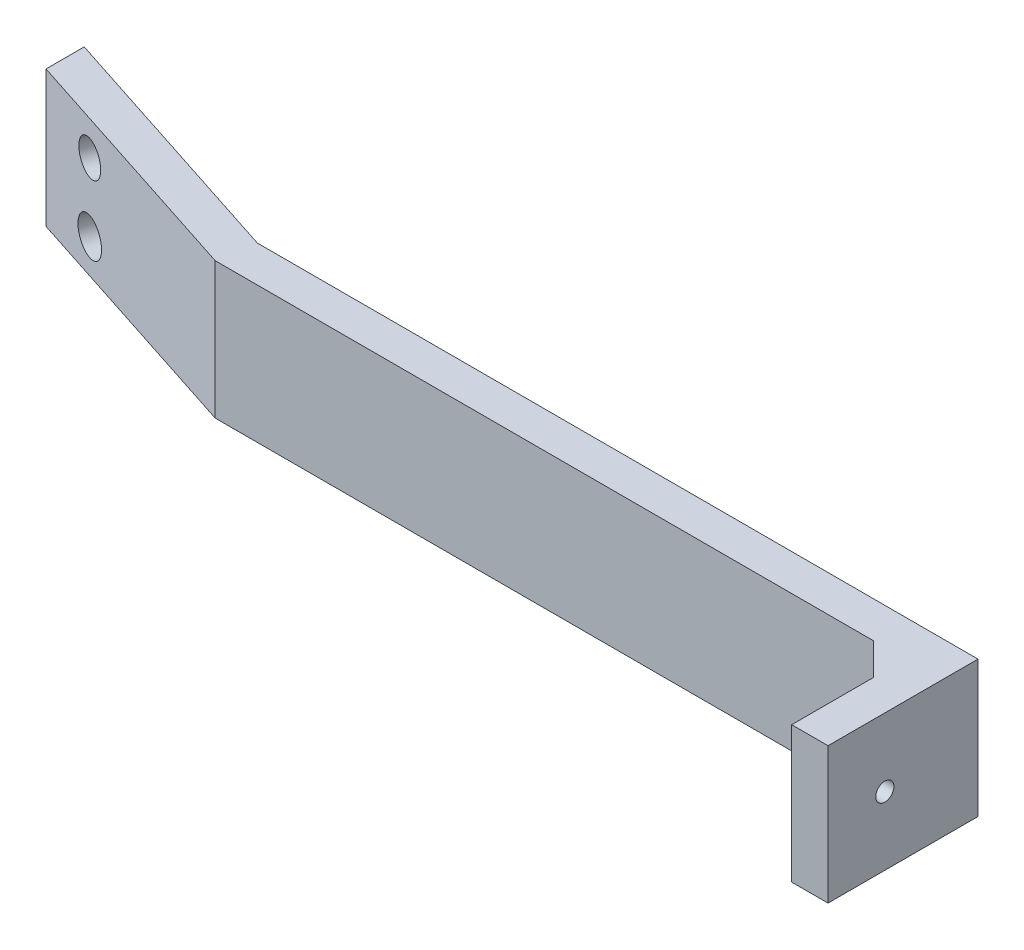
ISO-10303-21;
HEADER;
FILE_DESCRIPTION(('STEP AP214'),'2;1');
FILE_NAME('part.step','',(''),(''),'','','');
FILE_SCHEMA(('AUTOMOTIVE_DESIGN { 1 0 10303 214 1 1 1 1 }'));
ENDSEC;
DATA;
#1=APPLICATION_CONTEXT('core data for automotive mechanical design processes');
#2=APPLICATION_PROTOCOL_DEFINITION('international standard','automotive_design',2000,#1);
#3=PRODUCT_CONTEXT('',#1,'mechanical');
#4=PRODUCT('Part','Part','',(#3));
#5=PRODUCT_RELATED_PRODUCT_CATEGORY('part','',(#4));
#6=PRODUCT_DEFINITION_FORMATION('','',#4);
#7=PRODUCT_DEFINITION_CONTEXT('part definition',#1,'design');
#8=PRODUCT_DEFINITION('design','',#6,#7);
#9=PRODUCT_DEFINITION_SHAPE('','',#8);
#10=(LENGTH_UNIT() NAMED_UNIT(*) SI_UNIT(.MILLI.,.METRE.));
#11=(NAMED_UNIT(*) PLANE_ANGLE_UNIT() SI_UNIT($,.RADIAN.));
#12=(NAMED_UNIT(*) SI_UNIT($,.STERADIAN.) SOLID_ANGLE_UNIT());
#13=UNCERTAINTY_MEASURE_WITH_UNIT(LENGTH_MEASURE(1.E-05),#10,'distance_accuracy_value','');
#14=(GEOMETRIC_REPRESENTATION_CONTEXT(3) GLOBAL_UNCERTAINTY_ASSIGNED_CONTEXT((#13)) GLOBAL_UNIT_ASSIGNED_CONTEXT((#10,
#11,#12)) REPRESENTATION_CONTEXT('',''));
#15=CARTESIAN_POINT('',(0.,0.,0.));
#16=DIRECTION('',(0.,0.,1.));
#17=DIRECTION('',(1.,0.,0.));
#18=AXIS2_PLACEMENT_3D('',#15,#16,#17);
#19=CARTESIAN_POINT('',(0.,0.,50.));
#20=DIRECTION('',(0.,0.,1.));
#21=DIRECTION('',(1.,0.,0.));
#22=AXIS2_PLACEMENT_3D('',#19,#20,#21);
#23=PLANE('',#22);
#24=DIRECTION('',(1.,0.,0.));
#25=VECTOR('',#24,1.);
#26=CARTESIAN_POINT('',(92.5,10.,50.));
#27=LINE('',#26,#25);
#28=CARTESIAN_POINT('',(92.5,10.,50.));
#29=VERTEX_POINT('',#28);
#30=CARTESIAN_POINT('',(99.5,10.,50.));
#31=VERTEX_POINT('',#30);
#32=EDGE_CURVE('E218',#29,#31,#27,.T.);
#33=ORIENTED_EDGE('',*,*,#32,.F.);
#34=DIRECTION('',(0.,-1.,0.));
#35=VECTOR('',#34,1.);
#36=CARTESIAN_POINT('',(92.5,15.,50.));
#37=LINE('',#36,#35);
#38=CARTESIAN_POINT('',(92.5,15.,50.));
#39=VERTEX_POINT('',#38);
#40=EDGE_CURVE('E128',#39,#29,#37,.T.);
#41=ORIENTED_EDGE('',*,*,#40,.F.);
#42=DIRECTION('',(-1.,0.,0.));
#43=VECTOR('',#42,1.);
#44=CARTESIAN_POINT('',(-107.5,15.,50.));
#45=LINE('',#44,#43);
#46=CARTESIAN_POINT('',(-52.338722054881,15.,50.));
#47=VERTEX_POINT('',#46);
#48=EDGE_CURVE('E138',#39,#47,#45,.T.);
#49=ORIENTED_EDGE('',*,*,#48,.T.);
#50=DIRECTION('',(0.,1.,0.));
#51=VECTOR('',#50,1.);
#52=CARTESIAN_POINT('',(-52.338722054881,-15.,50.));
#53=LINE('',#52,#51);
#54=CARTESIAN_POINT('',(-52.338722054881,-15.,50.));
#55=VERTEX_POINT('',#54);
#56=EDGE_CURVE('E174',#55,#47,#53,.T.);
#57=ORIENTED_EDGE('',*,*,#56,.F.);
#58=DIRECTION('',(1.,0.,0.));
#59=VECTOR('',#58,1.);
#60=CARTESIAN_POINT('',(-107.5,-15.,50.));
#61=LINE('',#60,#59);
#62=CARTESIAN_POINT('',(92.5,-15.,50.));
#63=VERTEX_POINT('',#62);
#64=EDGE_CURVE('E182',#55,#63,#61,.T.);
#65=ORIENTED_EDGE('',*,*,#64,.T.);
#66=DIRECTION('',(0.,-1.,0.));
#67=VECTOR('',#66,1.);
#68=CARTESIAN_POINT('',(92.5,-15.,50.));
#69=LINE('',#68,#67);
#70=CARTESIAN_POINT('',(92.5,-9.99999999999999,50.));
#71=VERTEX_POINT('',#70);
#72=EDGE_CURVE('E223',#71,#63,#69,.T.);
#73=ORIENTED_EDGE('',*,*,#72,.F.);
#74=DIRECTION('',(1.,0.,0.));
#75=VECTOR('',#74,1.);
#76=CARTESIAN_POINT('',(92.5,-9.99999999999999,50.));
#77=LINE('',#76,#75);
#78=CARTESIAN_POINT('',(99.5,-10.,50.));
#79=VERTEX_POINT('',#78);
#80=EDGE_CURVE('E225',#71,#79,#77,.T.);
#81=ORIENTED_EDGE('',*,*,#80,.T.);
#82=DIRECTION('',(0.,-1.,0.));
#83=VECTOR('',#82,1.);
#84=CARTESIAN_POINT('',(99.5,15.,50.));
#85=LINE('',#84,#83);
#86=EDGE_CURVE('E232',#31,#79,#85,.T.);
#87=ORIENTED_EDGE('',*,*,#86,.F.);
#88=EDGE_LOOP('',(#33,#41,#49,#57,#65,#73,#81,#87));
#89=FACE_BOUND('',#88,.T.);
#90=ADVANCED_FACE('F34',(#89),#23,.T.);
#91=CARTESIAN_POINT('',(99.5,15.,75.));
#92=DIRECTION('',(1.,0.,0.));
#93=DIRECTION('',(0.,1.,0.));
#94=AXIS2_PLACEMENT_3D('',#91,#92,#93);
#95=PLANE('',#94);
#96=CARTESIAN_POINT('',(99.5,0.,62.5));
#97=DIRECTION('',(-1.,0.,0.));
#98=DIRECTION('',(0.,-1.,0.));
#99=AXIS2_PLACEMENT_3D('',#96,#97,#98);
#100=CIRCLE('',#99,2.);
#101=CARTESIAN_POINT('',(99.5,-2.,62.5));
#102=VERTEX_POINT('',#101);
#103=EDGE_CURVE('E198',#102,#102,#100,.T.);
#104=ORIENTED_EDGE('',*,*,#103,.F.);
#105=EDGE_LOOP('',(#104));
#106=FACE_BOUND('',#105,.T.);
#107=DIRECTION('',(0.,0.,-1.));
#108=VECTOR('',#107,1.);
#109=CARTESIAN_POINT('',(99.5,-10.,50.));
#110=LINE('',#109,#108);
#111=CARTESIAN_POINT('',(99.5,-9.99999999999999,57.));
#112=VERTEX_POINT('',#111);
#113=EDGE_CURVE('E226',#112,#79,#110,.T.);
#114=ORIENTED_EDGE('',*,*,#113,.F.);
#115=DIRECTION('',(0.,1.,0.));
#116=VECTOR('',#115,1.);
#117=CARTESIAN_POINT('',(99.5,-15.,57.));
#118=LINE('',#117,#116);
#119=CARTESIAN_POINT('',(99.5,-15.,57.));
#120=VERTEX_POINT('',#119);
#121=EDGE_CURVE('E222',#120,#112,#118,.T.);
#122=ORIENTED_EDGE('',*,*,#121,.F.);
#123=DIRECTION('',(0.,0.,-1.));
#124=VECTOR('',#123,1.);
#125=CARTESIAN_POINT('',(99.5,-15.,75.));
#126=LINE('',#125,#124);
#127=CARTESIAN_POINT('',(99.5,-15.,75.));
#128=VERTEX_POINT('',#127);
#129=EDGE_CURVE('E146',#128,#120,#126,.T.);
#130=ORIENTED_EDGE('',*,*,#129,.F.);
#131=DIRECTION('',(0.,-1.,0.));
#132=VECTOR('',#131,1.);
#133=CARTESIAN_POINT('',(99.5,15.,75.));
#134=LINE('',#133,#132);
#135=CARTESIAN_POINT('',(99.5,15.,75.));
#136=VERTEX_POINT('',#135);
#137=EDGE_CURVE('E144',#136,#128,#134,.T.);
#138=ORIENTED_EDGE('',*,*,#137,.F.);
#139=DIRECTION('',(0.,0.,-1.));
#140=VECTOR('',#139,1.);
#141=CARTESIAN_POINT('',(99.5,15.,75.));
#142=LINE('',#141,#140);
#143=CARTESIAN_POINT('',(99.5,15.,57.));
#144=VERTEX_POINT('',#143);
#145=EDGE_CURVE('E135',#136,#144,#142,.T.);
#146=ORIENTED_EDGE('',*,*,#145,.T.);
#147=DIRECTION('',(0.,1.,0.));
#148=VECTOR('',#147,1.);
#149=CARTESIAN_POINT('',(99.5,15.,57.));
#150=LINE('',#149,#148);
#151=CARTESIAN_POINT('',(99.5,10.,57.));
#152=VERTEX_POINT('',#151);
#153=EDGE_CURVE('E123',#152,#144,#150,.T.);
#154=ORIENTED_EDGE('',*,*,#153,.F.);
#155=DIRECTION('',(0.,0.,1.));
#156=VECTOR('',#155,1.);
#157=CARTESIAN_POINT('',(99.5,10.,50.));
#158=LINE('',#157,#156);
#159=EDGE_CURVE('E51',#31,#152,#158,.T.);
#160=ORIENTED_EDGE('',*,*,#159,.F.);
#161=ORIENTED_EDGE('',*,*,#86,.T.);
#162=EDGE_LOOP('',(#114,#122,#130,#138,#146,#154,#160,#161));
#163=FACE_BOUND('',#162,.T.);
#164=ADVANCED_FACE('F142',(#106,#163),#95,.F.);
#165=CARTESIAN_POINT('',(107.5,15.,50.));
#166=DIRECTION('',(-1.,0.,0.));
#167=DIRECTION('',(0.,0.,1.));
#168=AXIS2_PLACEMENT_3D('',#165,#166,#167);
#169=PLANE('',#168);
#170=CARTESIAN_POINT('',(107.5,0.,62.5));
#171=DIRECTION('',(-1.,0.,0.));
#172=DIRECTION('',(0.,-1.,0.));
#173=AXIS2_PLACEMENT_3D('',#170,#171,#172);
#174=CIRCLE('',#173,2.);
#175=CARTESIAN_POINT('',(107.5,-2.,62.5));
#176=VERTEX_POINT('',#175);
#177=EDGE_CURVE('E207',#176,#176,#174,.T.);
#178=ORIENTED_EDGE('',*,*,#177,.T.);
#179=EDGE_LOOP('',(#178));
#180=FACE_BOUND('',#179,.T.);
#181=DIRECTION('',(0.,0.,-1.));
#182=VECTOR('',#181,1.);
#183=CARTESIAN_POINT('',(107.5,-15.,50.));
#184=LINE('',#183,#182);
#185=CARTESIAN_POINT('',(107.5,-15.,75.));
#186=VERTEX_POINT('',#185);
#187=CARTESIAN_POINT('',(107.5,-15.,42.));
#188=VERTEX_POINT('',#187);
#189=EDGE_CURVE('E185',#186,#188,#184,.T.);
#190=ORIENTED_EDGE('',*,*,#189,.T.);
#191=DIRECTION('',(0.,1.,0.));
#192=VECTOR('',#191,1.);
#193=CARTESIAN_POINT('',(107.5,-15.,42.));
#194=LINE('',#193,#192);
#195=CARTESIAN_POINT('',(107.5,15.,42.));
#196=VERTEX_POINT('',#195);
#197=EDGE_CURVE('E164',#188,#196,#194,.T.);
#198=ORIENTED_EDGE('',*,*,#197,.T.);
#199=DIRECTION('',(0.,0.,-1.));
#200=VECTOR('',#199,1.);
#201=CARTESIAN_POINT('',(107.5,15.,50.));
#202=LINE('',#201,#200);
#203=CARTESIAN_POINT('',(107.5,15.,75.));
#204=VERTEX_POINT('',#203);
#205=EDGE_CURVE('E11',#204,#196,#202,.T.);
#206=ORIENTED_EDGE('',*,*,#205,.F.);
#207=DIRECTION('',(0.,1.,0.));
#208=VECTOR('',#207,1.);
#209=CARTESIAN_POINT('',(107.5,15.,75.));
#210=LINE('',#209,#208);
#211=EDGE_CURVE('E233',#186,#204,#210,.T.);
#212=ORIENTED_EDGE('',*,*,#211,.F.);
#213=EDGE_LOOP('',(#190,#198,#206,#212));
#214=FACE_BOUND('',#213,.T.);
#215=ADVANCED_FACE('F36',(#180,#214),#169,.F.);
#216=CARTESIAN_POINT('',(-107.5,15.,50.));
#217=DIRECTION('',(0.,-1.,0.));
#218=DIRECTION('',(0.,0.,-1.));
#219=AXIS2_PLACEMENT_3D('',#216,#217,#218);
#220=PLANE('',#219);
#221=ORIENTED_EDGE('',*,*,#48,.F.);
#222=DIRECTION('',(0.707106781186548,0.,0.707106781186547));
#223=VECTOR('',#222,1.);
#224=CARTESIAN_POINT('',(92.5,15.,50.));
#225=LINE('',#224,#223);
#226=EDGE_CURVE('E59',#39,#144,#225,.T.);
#227=ORIENTED_EDGE('',*,*,#226,.T.);
#228=ORIENTED_EDGE('',*,*,#145,.F.);
#229=DIRECTION('',(-1.,0.,0.));
#230=VECTOR('',#229,1.);
#231=CARTESIAN_POINT('',(107.5,15.,75.));
#232=LINE('',#231,#230);
#233=EDGE_CURVE('E236',#204,#136,#232,.T.);
#234=ORIENTED_EDGE('',*,*,#233,.F.);
#235=ORIENTED_EDGE('',*,*,#205,.T.);
#236=DIRECTION('',(1.,0.,0.));
#237=VECTOR('',#236,1.);
#238=CARTESIAN_POINT('',(107.5,15.,42.));
#239=LINE('',#238,#237);
#240=CARTESIAN_POINT('',(-51.0716465322847,15.,42.));
#241=VERTEX_POINT('',#240);
#242=EDGE_CURVE('E149',#241,#196,#239,.T.);
#243=ORIENTED_EDGE('',*,*,#242,.F.);
#244=DIRECTION('',(0.951056516295156,0.,0.309016994374942));
#245=VECTOR('',#244,1.);
#246=CARTESIAN_POINT('',(-107.5,15.,23.6653165323473));
#247=LINE('',#246,#245);
#248=CARTESIAN_POINT('',(-107.5,15.,23.6653165323473));
#249=VERTEX_POINT('',#248);
#250=EDGE_CURVE('E145',#249,#241,#247,.T.);
#251=ORIENTED_EDGE('',*,*,#250,.F.);
#252=DIRECTION('',(0.,0.,-1.));
#253=VECTOR('',#252,1.);
#254=CARTESIAN_POINT('',(-107.5,15.,50.));
#255=LINE('',#254,#253);
#256=CARTESIAN_POINT('',(-107.5,15.,32.0770143262534));
#257=VERTEX_POINT('',#256);
#258=EDGE_CURVE('E43',#257,#249,#255,.T.);
#259=ORIENTED_EDGE('',*,*,#258,.F.);
#260=DIRECTION('',(-0.951056516295155,0.,-0.309016994374942));
#261=VECTOR('',#260,1.);
#262=CARTESIAN_POINT('',(-107.5,15.,32.0770143262534));
#263=LINE('',#262,#261);
#264=EDGE_CURVE('E167',#47,#257,#263,.T.);
#265=ORIENTED_EDGE('',*,*,#264,.F.);
#266=EDGE_LOOP('',(#221,#227,#228,#234,#235,#243,#251,#259,#265));
#267=FACE_BOUND('',#266,.T.);
#268=ADVANCED_FACE('F133',(#267),#220,.F.);
#269=CARTESIAN_POINT('',(-107.5,15.,50.));
#270=DIRECTION('',(1.,0.,0.));
#271=DIRECTION('',(0.,0.,-1.));
#272=AXIS2_PLACEMENT_3D('',#269,#270,#271);
#273=PLANE('',#272);
#274=ORIENTED_EDGE('',*,*,#258,.T.);
#275=DIRECTION('',(0.,1.,0.));
#276=VECTOR('',#275,1.);
#277=CARTESIAN_POINT('',(-107.5,-15.,23.6653165323473));
#278=LINE('',#277,#276);
#279=CARTESIAN_POINT('',(-107.5,-15.,23.6653165323473));
#280=VERTEX_POINT('',#279);
#281=EDGE_CURVE('E161',#280,#249,#278,.T.);
#282=ORIENTED_EDGE('',*,*,#281,.F.);
#283=DIRECTION('',(0.,0.,-1.));
#284=VECTOR('',#283,1.);
#285=CARTESIAN_POINT('',(-107.5,-15.,50.));
#286=LINE('',#285,#284);
#287=CARTESIAN_POINT('',(-107.5,-15.,32.0770143262534));
#288=VERTEX_POINT('',#287);
#289=EDGE_CURVE('E188',#288,#280,#286,.T.);
#290=ORIENTED_EDGE('',*,*,#289,.F.);
#291=DIRECTION('',(0.,1.,0.));
#292=VECTOR('',#291,1.);
#293=CARTESIAN_POINT('',(-107.5,-15.,32.0770143262534));
#294=LINE('',#293,#292);
#295=EDGE_CURVE('E176',#288,#257,#294,.T.);
#296=ORIENTED_EDGE('',*,*,#295,.T.);
#297=EDGE_LOOP('',(#274,#282,#290,#296));
#298=FACE_BOUND('',#297,.T.);
#299=ADVANCED_FACE('F269',(#298),#273,.F.);
#300=CARTESIAN_POINT('',(-107.5,-15.,50.));
#301=DIRECTION('',(0.,1.,0.));
#302=DIRECTION('',(0.,0.,1.));
#303=AXIS2_PLACEMENT_3D('',#300,#301,#302);
#304=PLANE('',#303);
#305=ORIENTED_EDGE('',*,*,#129,.T.);
#306=DIRECTION('',(0.707106781186548,0.,0.707106781186547));
#307=VECTOR('',#306,1.);
#308=CARTESIAN_POINT('',(92.5,-15.,50.));
#309=LINE('',#308,#307);
#310=EDGE_CURVE('E139',#63,#120,#309,.T.);
#311=ORIENTED_EDGE('',*,*,#310,.F.);
#312=ORIENTED_EDGE('',*,*,#64,.F.);
#313=DIRECTION('',(-0.951056516295155,0.,-0.309016994374942));
#314=VECTOR('',#313,1.);
#315=CARTESIAN_POINT('',(-107.5,-15.,32.0770143262534));
#316=LINE('',#315,#314);
#317=EDGE_CURVE('E171',#55,#288,#316,.T.);
#318=ORIENTED_EDGE('',*,*,#317,.T.);
#319=ORIENTED_EDGE('',*,*,#289,.T.);
#320=DIRECTION('',(0.951056516295156,0.,0.309016994374942));
#321=VECTOR('',#320,1.);
#322=CARTESIAN_POINT('',(-107.5,-15.,23.6653165323473));
#323=LINE('',#322,#321);
#324=CARTESIAN_POINT('',(-51.0716465322847,-15.,42.));
#325=VERTEX_POINT('',#324);
#326=EDGE_CURVE('E156',#280,#325,#323,.T.);
#327=ORIENTED_EDGE('',*,*,#326,.T.);
#328=DIRECTION('',(1.,0.,0.));
#329=VECTOR('',#328,1.);
#330=CARTESIAN_POINT('',(107.5,-15.,42.));
#331=LINE('',#330,#329);
#332=EDGE_CURVE('E159',#325,#188,#331,.T.);
#333=ORIENTED_EDGE('',*,*,#332,.T.);
#334=ORIENTED_EDGE('',*,*,#189,.F.);
#335=DIRECTION('',(1.,0.,0.));
#336=VECTOR('',#335,1.);
#337=CARTESIAN_POINT('',(107.5,-15.,75.));
#338=LINE('',#337,#336);
#339=EDGE_CURVE('E152',#128,#186,#338,.T.);
#340=ORIENTED_EDGE('',*,*,#339,.F.);
#341=EDGE_LOOP('',(#305,#311,#312,#318,#319,#327,#333,#334,#340));
#342=FACE_BOUND('',#341,.T.);
#343=ADVANCED_FACE('F252',(#342),#304,.F.);
#344=CARTESIAN_POINT('',(-107.5,-15.,32.0770143262534));
#345=DIRECTION('',(0.309016994374942,0.,-0.951056516295155));
#346=DIRECTION('',(-0.951056516295155,0.,-0.309016994374942));
#347=AXIS2_PLACEMENT_3D('',#344,#345,#346);
#348=PLANE('',#347);
#349=CARTESIAN_POINT('',(-93.2341522555727,7.5,36.7122692418775));
#350=DIRECTION('',(-0.309016994374942,0.,0.951056516295155));
#351=DIRECTION('',(0.951056516295155,0.,0.309016994374942));
#352=AXIS2_PLACEMENT_3D('',#349,#350,#351);
#353=CIRCLE('',#352,3.74009906115303);
#354=CARTESIAN_POINT('',(-89.6771066718737,7.5,37.8680234124195));
#355=VERTEX_POINT('',#354);
#356=EDGE_CURVE('E194',#355,#355,#353,.T.);
#357=ORIENTED_EDGE('',*,*,#356,.F.);
#358=EDGE_LOOP('',(#357));
#359=FACE_BOUND('',#358,.T.);
#360=CARTESIAN_POINT('',(-93.2341522555727,-7.5,36.7122692418775));
#361=DIRECTION('',(-0.309016994374942,0.,0.951056516295155));
#362=DIRECTION('',(0.951056516295155,0.,0.309016994374942));
#363=AXIS2_PLACEMENT_3D('',#360,#361,#362);
#364=CIRCLE('',#363,4.03421575100136);
#365=CARTESIAN_POINT('',(-89.3973850774423,-7.5,37.958910467912));
#366=VERTEX_POINT('',#365);
#367=EDGE_CURVE('E200',#366,#366,#364,.T.);
#368=ORIENTED_EDGE('',*,*,#367,.F.);
#369=EDGE_LOOP('',(#368));
#370=FACE_BOUND('',#369,.T.);
#371=ORIENTED_EDGE('',*,*,#264,.T.);
#372=ORIENTED_EDGE('',*,*,#295,.F.);
#373=ORIENTED_EDGE('',*,*,#317,.F.);
#374=ORIENTED_EDGE('',*,*,#56,.T.);
#375=EDGE_LOOP('',(#371,#372,#373,#374));
#376=FACE_BOUND('',#375,.T.);
#377=ADVANCED_FACE('F272',(#359,#370,#376),#348,.F.);
#378=CARTESIAN_POINT('',(107.5,-15.,42.));
#379=DIRECTION('',(0.,0.,1.));
#380=DIRECTION('',(1.,0.,0.));
#381=AXIS2_PLACEMENT_3D('',#378,#379,#380);
#382=PLANE('',#381);
#383=ORIENTED_EDGE('',*,*,#242,.T.);
#384=ORIENTED_EDGE('',*,*,#197,.F.);
#385=ORIENTED_EDGE('',*,*,#332,.F.);
#386=DIRECTION('',(0.,1.,0.));
#387=VECTOR('',#386,1.);
#388=CARTESIAN_POINT('',(-51.0716465322847,-15.,42.));
#389=LINE('',#388,#387);
#390=EDGE_CURVE('E168',#325,#241,#389,.T.);
#391=ORIENTED_EDGE('',*,*,#390,.T.);
#392=EDGE_LOOP('',(#383,#384,#385,#391));
#393=FACE_BOUND('',#392,.T.);
#394=ADVANCED_FACE('F262',(#393),#382,.F.);
#395=CARTESIAN_POINT('',(-107.5,-15.,23.6653165323473));
#396=DIRECTION('',(-0.309016994374942,0.,0.951056516295155));
#397=DIRECTION('',(0.951056516295155,0.,0.309016994374942));
#398=AXIS2_PLACEMENT_3D('',#395,#396,#397);
#399=PLANE('',#398);
#400=CARTESIAN_POINT('',(-90.7620163005732,7.5,29.1038171115163));
#401=DIRECTION('',(-0.309016994374942,0.,0.951056516295155));
#402=DIRECTION('',(0.951056516295155,0.,0.309016994374942));
#403=AXIS2_PLACEMENT_3D('',#400,#401,#402);
#404=CIRCLE('',#403,3.74009906115303);
#405=CARTESIAN_POINT('',(-87.2049707168742,7.5,30.2595712820583));
#406=VERTEX_POINT('',#405);
#407=EDGE_CURVE('E38',#406,#406,#404,.T.);
#408=ORIENTED_EDGE('',*,*,#407,.T.);
#409=EDGE_LOOP('',(#408));
#410=FACE_BOUND('',#409,.T.);
#411=CARTESIAN_POINT('',(-90.7620163005732,-7.5,29.1038171115163));
#412=DIRECTION('',(-0.309016994374942,0.,0.951056516295155));
#413=DIRECTION('',(0.951056516295155,0.,0.309016994374942));
#414=AXIS2_PLACEMENT_3D('',#411,#412,#413);
#415=CIRCLE('',#414,4.03421575100136);
#416=CARTESIAN_POINT('',(-86.9252491224428,-7.5,30.3504583375507));
#417=VERTEX_POINT('',#416);
#418=EDGE_CURVE('E192',#417,#417,#415,.T.);
#419=ORIENTED_EDGE('',*,*,#418,.T.);
#420=EDGE_LOOP('',(#419));
#421=FACE_BOUND('',#420,.T.);
#422=ORIENTED_EDGE('',*,*,#250,.T.);
#423=ORIENTED_EDGE('',*,*,#390,.F.);
#424=ORIENTED_EDGE('',*,*,#326,.F.);
#425=ORIENTED_EDGE('',*,*,#281,.T.);
#426=EDGE_LOOP('',(#422,#423,#424,#425));
#427=FACE_BOUND('',#426,.T.);
#428=ADVANCED_FACE('F265',(#410,#421,#427),#399,.F.);
#429=CARTESIAN_POINT('',(0.,0.,75.));
#430=DIRECTION('',(0.,0.,-1.));
#431=DIRECTION('',(-1.,0.,0.));
#432=AXIS2_PLACEMENT_3D('',#429,#430,#431);
#433=PLANE('',#432);
#434=ORIENTED_EDGE('',*,*,#211,.T.);
#435=ORIENTED_EDGE('',*,*,#233,.T.);
#436=ORIENTED_EDGE('',*,*,#137,.T.);
#437=ORIENTED_EDGE('',*,*,#339,.T.);
#438=EDGE_LOOP('',(#434,#435,#436,#437));
#439=FACE_BOUND('',#438,.T.);
#440=ADVANCED_FACE('F256',(#439),#433,.F.);
#441=CARTESIAN_POINT('',(92.5,-9.99999999999999,50.));
#442=DIRECTION('',(0.,-1.,0.));
#443=DIRECTION('',(1.,0.,0.));
#444=AXIS2_PLACEMENT_3D('',#441,#442,#443);
#445=PLANE('',#444);
#446=ORIENTED_EDGE('',*,*,#80,.F.);
#447=DIRECTION('',(0.707106781186548,0.,0.707106781186547));
#448=VECTOR('',#447,1.);
#449=CARTESIAN_POINT('',(92.5,-9.99999999999999,50.));
#450=LINE('',#449,#448);
#451=EDGE_CURVE('E214',#71,#112,#450,.T.);
#452=ORIENTED_EDGE('',*,*,#451,.T.);
#453=ORIENTED_EDGE('',*,*,#113,.T.);
#454=EDGE_LOOP('',(#446,#452,#453));
#455=FACE_BOUND('',#454,.T.);
#456=ADVANCED_FACE('F246',(#455),#445,.F.);
#457=CARTESIAN_POINT('',(92.5,10.,50.));
#458=DIRECTION('',(0.,1.,0.));
#459=DIRECTION('',(-1.,0.,0.));
#460=AXIS2_PLACEMENT_3D('',#457,#458,#459);
#461=PLANE('',#460);
#462=ORIENTED_EDGE('',*,*,#159,.T.);
#463=DIRECTION('',(-0.707106781186548,0.,-0.707106781186547));
#464=VECTOR('',#463,1.);
#465=CARTESIAN_POINT('',(92.5,10.,50.));
#466=LINE('',#465,#464);
#467=EDGE_CURVE('E126',#152,#29,#466,.T.);
#468=ORIENTED_EDGE('',*,*,#467,.T.);
#469=ORIENTED_EDGE('',*,*,#32,.T.);
#470=EDGE_LOOP('',(#462,#468,#469));
#471=FACE_BOUND('',#470,.T.);
#472=ADVANCED_FACE('F274',(#471),#461,.F.);
#473=CARTESIAN_POINT('',(92.5,15.,50.));
#474=DIRECTION('',(0.707106781186547,0.,-0.707106781186548));
#475=DIRECTION('',(-0.707106781186548,0.,-0.707106781186547));
#476=AXIS2_PLACEMENT_3D('',#473,#474,#475);
#477=PLANE('',#476);
#478=ORIENTED_EDGE('',*,*,#153,.T.);
#479=ORIENTED_EDGE('',*,*,#226,.F.);
#480=ORIENTED_EDGE('',*,*,#40,.T.);
#481=ORIENTED_EDGE('',*,*,#467,.F.);
#482=EDGE_LOOP('',(#478,#479,#480,#481));
#483=FACE_BOUND('',#482,.T.);
#484=ADVANCED_FACE('F124',(#483),#477,.F.);
#485=ORIENTED_EDGE('',*,*,#72,.T.);
#486=ORIENTED_EDGE('',*,*,#310,.T.);
#487=ORIENTED_EDGE('',*,*,#121,.T.);
#488=ORIENTED_EDGE('',*,*,#451,.F.);
#489=EDGE_LOOP('',(#485,#486,#487,#488));
#490=FACE_BOUND('',#489,.T.);
#491=ADVANCED_FACE('F248',(#490),#477,.F.);
#492=CARTESIAN_POINT('',(107.5,0.,62.5));
#493=DIRECTION('',(-1.,0.,0.));
#494=DIRECTION('',(0.,-1.,0.));
#495=AXIS2_PLACEMENT_3D('',#492,#493,#494);
#496=CYLINDRICAL_SURFACE('',#495,2.);
#497=ORIENTED_EDGE('',*,*,#177,.F.);
#498=EDGE_LOOP('',(#497));
#499=FACE_BOUND('',#498,.T.);
#500=ORIENTED_EDGE('',*,*,#103,.T.);
#501=EDGE_LOOP('',(#500));
#502=FACE_BOUND('',#501,.T.);
#503=ADVANCED_FACE('F305',(#499,#502),#496,.F.);
#504=CARTESIAN_POINT('',(-70.2313431958808,-7.5,-34.0830975099236));
#505=DIRECTION('',(-0.309016994374942,0.,0.951056516295155));
#506=DIRECTION('',(0.951056516295155,0.,0.309016994374942));
#507=AXIS2_PLACEMENT_3D('',#504,#505,#506);
#508=CYLINDRICAL_SURFACE('',#507,4.03421575100136);
#509=ORIENTED_EDGE('',*,*,#367,.T.);
#510=EDGE_LOOP('',(#509));
#511=FACE_BOUND('',#510,.T.);
#512=ORIENTED_EDGE('',*,*,#418,.F.);
#513=EDGE_LOOP('',(#512));
#514=FACE_BOUND('',#513,.T.);
#515=ADVANCED_FACE('F308',(#511,#514),#508,.F.);
#516=CARTESIAN_POINT('',(-70.2313431958808,7.5,-34.0830975099236));
#517=DIRECTION('',(-0.309016994374942,0.,0.951056516295155));
#518=DIRECTION('',(0.951056516295155,0.,0.309016994374942));
#519=AXIS2_PLACEMENT_3D('',#516,#517,#518);
#520=CYLINDRICAL_SURFACE('',#519,3.74009906115303);
#521=ORIENTED_EDGE('',*,*,#356,.T.);
#522=EDGE_LOOP('',(#521));
#523=FACE_BOUND('',#522,.T.);
#524=ORIENTED_EDGE('',*,*,#407,.F.);
#525=EDGE_LOOP('',(#524));
#526=FACE_BOUND('',#525,.T.);
#527=ADVANCED_FACE('F315',(#523,#526),#520,.F.);
#528=CLOSED_SHELL('',(#90,#164,#215,#268,#299,#343,#377,#394,#428,#440,#456,#472,#484,#491,#503,
#515,#527));
#529=MANIFOLD_SOLID_BREP('B2',#528);
#530=ADVANCED_BREP_SHAPE_REPRESENTATION('',(#18,#529),#14);
#531=SHAPE_DEFINITION_REPRESENTATION(#9,#530);
ENDSEC;
END-ISO-10303-21;
